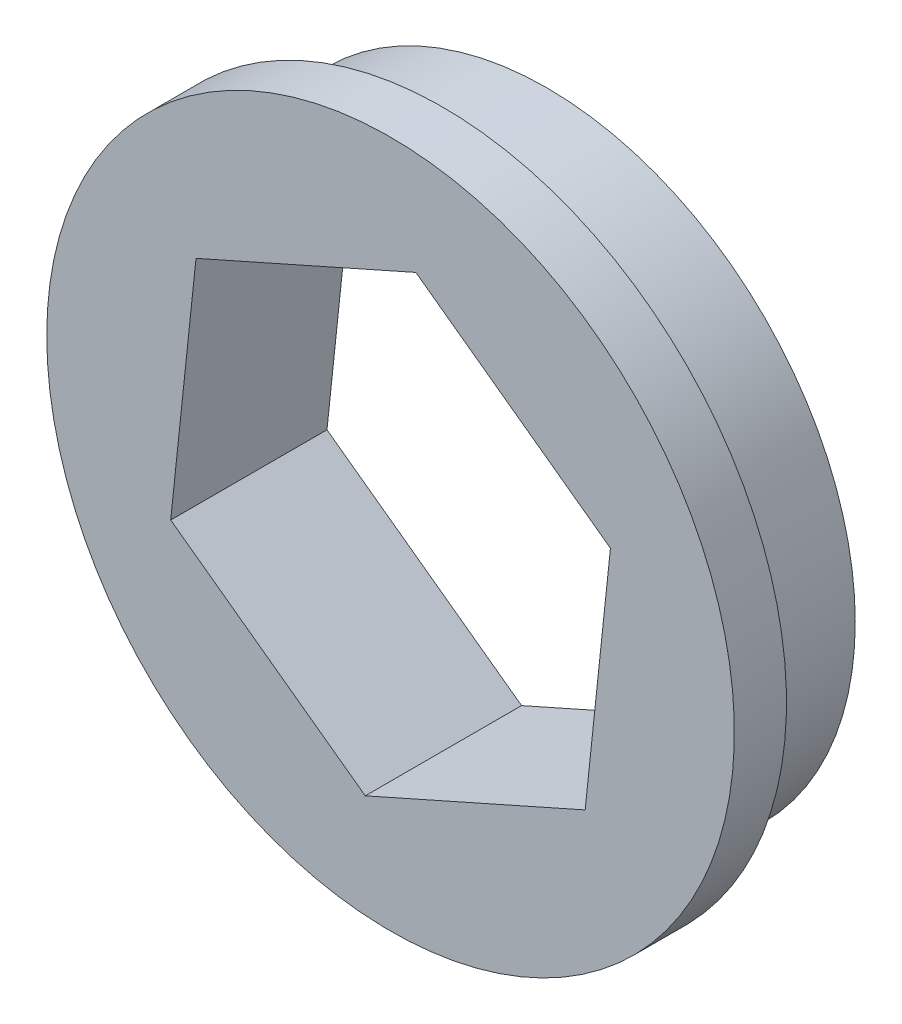
ISO-10303-21;
HEADER;
FILE_DESCRIPTION(('STEP AP214'),'2;1');
FILE_NAME('part.step','',(''),(''),'','','');
FILE_SCHEMA(('AUTOMOTIVE_DESIGN { 1 0 10303 214 1 1 1 1 }'));
ENDSEC;
DATA;
#1=APPLICATION_CONTEXT('core data for automotive mechanical design processes');
#2=APPLICATION_PROTOCOL_DEFINITION('international standard','automotive_design',2000,#1);
#3=PRODUCT_CONTEXT('',#1,'mechanical');
#4=PRODUCT('Part','Part','',(#3));
#5=PRODUCT_RELATED_PRODUCT_CATEGORY('part','',(#4));
#6=PRODUCT_DEFINITION_FORMATION('','',#4);
#7=PRODUCT_DEFINITION_CONTEXT('part definition',#1,'design');
#8=PRODUCT_DEFINITION('design','',#6,#7);
#9=PRODUCT_DEFINITION_SHAPE('','',#8);
#10=(LENGTH_UNIT() NAMED_UNIT(*) SI_UNIT(.MILLI.,.METRE.));
#11=(NAMED_UNIT(*) PLANE_ANGLE_UNIT() SI_UNIT($,.RADIAN.));
#12=(NAMED_UNIT(*) SI_UNIT($,.STERADIAN.) SOLID_ANGLE_UNIT());
#13=UNCERTAINTY_MEASURE_WITH_UNIT(LENGTH_MEASURE(1.E-05),#10,'distance_accuracy_value','');
#14=(GEOMETRIC_REPRESENTATION_CONTEXT(3) GLOBAL_UNCERTAINTY_ASSIGNED_CONTEXT((#13)) GLOBAL_UNIT_ASSIGNED_CONTEXT((#10,
#11,#12)) REPRESENTATION_CONTEXT('',''));
#15=CARTESIAN_POINT('',(0.,0.,0.));
#16=DIRECTION('',(0.,0.,1.));
#17=DIRECTION('',(1.,0.,0.));
#18=AXIS2_PLACEMENT_3D('',#15,#16,#17);
#19=CARTESIAN_POINT('',(0.,0.,3.175));
#20=DIRECTION('',(0.,0.,-1.));
#21=DIRECTION('',(-1.,0.,0.));
#22=AXIS2_PLACEMENT_3D('',#19,#20,#21);
#23=CYLINDRICAL_SURFACE('',#22,9.398);
#24=CARTESIAN_POINT('',(0.,0.,0.));
#25=DIRECTION('',(0.,0.,-1.));
#26=DIRECTION('',(-1.,0.,0.));
#27=AXIS2_PLACEMENT_3D('',#24,#25,#26);
#28=CIRCLE('',#27,9.398);
#29=CARTESIAN_POINT('',(-9.398,0.,0.));
#30=VERTEX_POINT('',#29);
#31=EDGE_CURVE('E103',#30,#30,#28,.F.);
#32=ORIENTED_EDGE('',*,*,#31,.T.);
#33=EDGE_LOOP('',(#32));
#34=FACE_BOUND('',#33,.T.);
#35=CARTESIAN_POINT('',(0.,0.,3.175));
#36=DIRECTION('',(0.,0.,-1.));
#37=DIRECTION('',(-1.,0.,0.));
#38=AXIS2_PLACEMENT_3D('',#35,#36,#37);
#39=CIRCLE('',#38,9.398);
#40=CARTESIAN_POINT('',(-9.398,0.,3.175));
#41=VERTEX_POINT('',#40);
#42=EDGE_CURVE('E20',#41,#41,#39,.T.);
#43=ORIENTED_EDGE('',*,*,#42,.T.);
#44=EDGE_LOOP('',(#43));
#45=FACE_BOUND('',#44,.T.);
#46=ADVANCED_FACE('F17',(#34,#45),#23,.T.);
#47=CARTESIAN_POINT('',(0.,0.,3.175));
#48=DIRECTION('',(0.,0.,1.));
#49=DIRECTION('',(1.,0.,0.));
#50=AXIS2_PLACEMENT_3D('',#47,#48,#49);
#51=PLANE('',#50);
#52=ORIENTED_EDGE('',*,*,#42,.F.);
#53=EDGE_LOOP('',(#52));
#54=FACE_BOUND('',#53,.T.);
#55=CARTESIAN_POINT('',(0.,0.,3.175));
#56=DIRECTION('',(0.,0.,-1.));
#57=DIRECTION('',(-1.,0.,0.));
#58=AXIS2_PLACEMENT_3D('',#55,#56,#57);
#59=CIRCLE('',#58,10.4775);
#60=CARTESIAN_POINT('',(-10.4775,0.,3.175));
#61=VERTEX_POINT('',#60);
#62=EDGE_CURVE('E87',#61,#61,#59,.F.);
#63=ORIENTED_EDGE('',*,*,#62,.F.);
#64=EDGE_LOOP('',(#63));
#65=FACE_BOUND('',#64,.T.);
#66=ADVANCED_FACE('F111',(#54,#65),#51,.F.);
#67=CARTESIAN_POINT('',(0.,0.,0.));
#68=DIRECTION('',(0.,0.,1.));
#69=DIRECTION('',(1.,0.,0.));
#70=AXIS2_PLACEMENT_3D('',#67,#68,#69);
#71=PLANE('',#70);
#72=DIRECTION('',(0.913795750397395,0.406174010192259,0.));
#73=VECTOR('',#72,1.);
#74=CARTESIAN_POINT('',(0.770929448003481,7.29170769570027,0.));
#75=LINE('',#74,#73);
#76=CARTESIAN_POINT('',(-5.9293393774452,4.31349833434665,0.));
#77=VERTEX_POINT('',#76);
#78=CARTESIAN_POINT('',(0.770929448003468,7.29170769570028,0.));
#79=VERTEX_POINT('',#78);
#80=EDGE_CURVE('E74',#77,#79,#75,.T.);
#81=ORIENTED_EDGE('',*,*,#80,.F.);
#82=DIRECTION('',(0.105140864015202,0.994457338810538,0.));
#83=VECTOR('',#82,1.);
#84=CARTESIAN_POINT('',(-5.92933937744518,4.31349833434666,0.));
#85=LINE('',#84,#83);
#86=CARTESIAN_POINT('',(-6.70026882544866,-2.97820936135361,0.));
#87=VERTEX_POINT('',#86);
#88=EDGE_CURVE('E238',#87,#77,#85,.T.);
#89=ORIENTED_EDGE('',*,*,#88,.F.);
#90=DIRECTION('',(-0.808654886382194,0.588283328618279,0.));
#91=VECTOR('',#90,1.);
#92=CARTESIAN_POINT('',(-6.70026882544865,-2.97820936135359,0.));
#93=LINE('',#92,#91);
#94=CARTESIAN_POINT('',(-0.770929448003467,-7.29170769570028,0.));
#95=VERTEX_POINT('',#94);
#96=EDGE_CURVE('E243',#95,#87,#93,.T.);
#97=ORIENTED_EDGE('',*,*,#96,.F.);
#98=DIRECTION('',(-0.913795750397395,-0.406174010192259,0.));
#99=VECTOR('',#98,1.);
#100=CARTESIAN_POINT('',(-0.770929448003481,-7.29170769570027,0.));
#101=LINE('',#100,#99);
#102=CARTESIAN_POINT('',(5.9293393774452,-4.31349833434665,0.));
#103=VERTEX_POINT('',#102);
#104=EDGE_CURVE('E246',#103,#95,#101,.T.);
#105=ORIENTED_EDGE('',*,*,#104,.F.);
#106=DIRECTION('',(-0.105140864015202,-0.994457338810538,0.));
#107=VECTOR('',#106,1.);
#108=CARTESIAN_POINT('',(5.92933937744518,-4.31349833434666,0.));
#109=LINE('',#108,#107);
#110=CARTESIAN_POINT('',(6.70026882544866,2.97820936135361,0.));
#111=VERTEX_POINT('',#110);
#112=EDGE_CURVE('E68',#111,#103,#109,.T.);
#113=ORIENTED_EDGE('',*,*,#112,.F.);
#114=DIRECTION('',(0.808654886382194,-0.588283328618279,0.));
#115=VECTOR('',#114,1.);
#116=CARTESIAN_POINT('',(6.70026882544865,2.97820936135359,0.));
#117=LINE('',#116,#115);
#118=EDGE_CURVE('E70',#79,#111,#117,.T.);
#119=ORIENTED_EDGE('',*,*,#118,.F.);
#120=EDGE_LOOP('',(#81,#89,#97,#105,#113,#119));
#121=FACE_BOUND('',#120,.T.);
#122=ORIENTED_EDGE('',*,*,#31,.F.);
#123=EDGE_LOOP('',(#122));
#124=FACE_BOUND('',#123,.T.);
#125=ADVANCED_FACE('F72',(#121,#124),#71,.F.);
#126=CARTESIAN_POINT('',(0.,0.,4.7625));
#127=DIRECTION('',(0.,0.,-1.));
#128=DIRECTION('',(-1.,0.,0.));
#129=AXIS2_PLACEMENT_3D('',#126,#127,#128);
#130=CYLINDRICAL_SURFACE('',#129,10.4775);
#131=ORIENTED_EDGE('',*,*,#62,.T.);
#132=EDGE_LOOP('',(#131));
#133=FACE_BOUND('',#132,.T.);
#134=CARTESIAN_POINT('',(0.,0.,4.7625));
#135=DIRECTION('',(0.,0.,-1.));
#136=DIRECTION('',(-1.,0.,0.));
#137=AXIS2_PLACEMENT_3D('',#134,#135,#136);
#138=CIRCLE('',#137,10.4775);
#139=CARTESIAN_POINT('',(-10.4775,0.,4.7625));
#140=VERTEX_POINT('',#139);
#141=EDGE_CURVE('E98',#140,#140,#138,.F.);
#142=ORIENTED_EDGE('',*,*,#141,.F.);
#143=EDGE_LOOP('',(#142));
#144=FACE_BOUND('',#143,.T.);
#145=ADVANCED_FACE('F116',(#133,#144),#130,.T.);
#146=CARTESIAN_POINT('',(0.770929448003481,7.29170769570027,3.175));
#147=DIRECTION('',(0.406174010192259,-0.913795750397395,0.));
#148=DIRECTION('',(0.913795750397395,0.406174010192259,0.));
#149=AXIS2_PLACEMENT_3D('',#146,#147,#148);
#150=PLANE('',#149);
#151=DIRECTION('',(0.913795750397391,0.406174010192268,0.));
#152=VECTOR('',#151,1.);
#153=CARTESIAN_POINT('',(-5.92933937744523,4.31349833434661,4.7625));
#154=LINE('',#153,#152);
#155=CARTESIAN_POINT('',(-5.92933937744522,4.31349833434664,4.7625));
#156=VERTEX_POINT('',#155);
#157=CARTESIAN_POINT('',(0.770929448003449,7.29170769570028,4.7625));
#158=VERTEX_POINT('',#157);
#159=EDGE_CURVE('E101',#156,#158,#154,.T.);
#160=ORIENTED_EDGE('',*,*,#159,.F.);
#161=DIRECTION('',(0.,0.,1.));
#162=VECTOR('',#161,1.);
#163=CARTESIAN_POINT('',(-5.92933937744518,4.31349833434666,3.175));
#164=LINE('',#163,#162);
#165=EDGE_CURVE('E85',#77,#156,#164,.T.);
#166=ORIENTED_EDGE('',*,*,#165,.F.);
#167=ORIENTED_EDGE('',*,*,#80,.T.);
#168=DIRECTION('',(0.,0.,1.));
#169=VECTOR('',#168,1.);
#170=CARTESIAN_POINT('',(0.770929448003423,7.29170769570029,3.175));
#171=LINE('',#170,#169);
#172=EDGE_CURVE('E79',#158,#79,#171,.F.);
#173=ORIENTED_EDGE('',*,*,#172,.F.);
#174=EDGE_LOOP('',(#160,#166,#167,#173));
#175=FACE_BOUND('',#174,.T.);
#176=ADVANCED_FACE('F82',(#175),#150,.T.);
#177=CARTESIAN_POINT('',(6.70026882544865,2.97820936135359,3.175));
#178=DIRECTION('',(-0.588283328618279,-0.808654886382194,0.));
#179=DIRECTION('',(0.808654886382194,-0.588283328618279,0.));
#180=AXIS2_PLACEMENT_3D('',#177,#178,#179);
#181=PLANE('',#180);
#182=DIRECTION('',(0.808654886382199,-0.588283328618271,0.));
#183=VECTOR('',#182,1.);
#184=CARTESIAN_POINT('',(0.770929448003408,7.29170769570027,4.7625));
#185=LINE('',#184,#183);
#186=CARTESIAN_POINT('',(6.70026882544865,2.97820936135363,4.7625));
#187=VERTEX_POINT('',#186);
#188=EDGE_CURVE('E91',#158,#187,#185,.T.);
#189=ORIENTED_EDGE('',*,*,#188,.F.);
#190=ORIENTED_EDGE('',*,*,#172,.T.);
#191=ORIENTED_EDGE('',*,*,#118,.T.);
#192=DIRECTION('',(0.,0.,1.));
#193=VECTOR('',#192,1.);
#194=CARTESIAN_POINT('',(6.70026882544867,2.97820936135366,3.175));
#195=LINE('',#194,#193);
#196=EDGE_CURVE('E94',#187,#111,#195,.F.);
#197=ORIENTED_EDGE('',*,*,#196,.F.);
#198=EDGE_LOOP('',(#189,#190,#191,#197));
#199=FACE_BOUND('',#198,.T.);
#200=ADVANCED_FACE('F89',(#199),#181,.T.);
#201=CARTESIAN_POINT('',(5.92933937744518,-4.31349833434666,3.175));
#202=DIRECTION('',(-0.994457338810538,0.105140864015202,0.));
#203=DIRECTION('',(-0.105140864015202,-0.994457338810538,0.));
#204=AXIS2_PLACEMENT_3D('',#201,#202,#203);
#205=PLANE('',#204);
#206=DIRECTION('',(-0.10514086401519,-0.994457338810539,0.));
#207=VECTOR('',#206,1.);
#208=CARTESIAN_POINT('',(6.70026882544863,2.97820936135367,4.7625));
#209=LINE('',#208,#207);
#210=CARTESIAN_POINT('',(5.92933937744521,-4.31349833434664,4.7625));
#211=VERTEX_POINT('',#210);
#212=EDGE_CURVE('E225',#187,#211,#209,.T.);
#213=ORIENTED_EDGE('',*,*,#212,.F.);
#214=ORIENTED_EDGE('',*,*,#196,.T.);
#215=ORIENTED_EDGE('',*,*,#112,.T.);
#216=DIRECTION('',(0.,0.,1.));
#217=VECTOR('',#216,1.);
#218=CARTESIAN_POINT('',(5.92933937744525,-4.31349833434664,3.175));
#219=LINE('',#218,#217);
#220=EDGE_CURVE('E227',#211,#103,#219,.F.);
#221=ORIENTED_EDGE('',*,*,#220,.F.);
#222=EDGE_LOOP('',(#213,#214,#215,#221));
#223=FACE_BOUND('',#222,.T.);
#224=ADVANCED_FACE('F141',(#223),#205,.T.);
#225=CARTESIAN_POINT('',(-0.770929448003481,-7.29170769570027,3.175));
#226=DIRECTION('',(-0.406174010192259,0.913795750397395,0.));
#227=DIRECTION('',(-0.913795750397395,-0.406174010192259,0.));
#228=AXIS2_PLACEMENT_3D('',#225,#226,#227);
#229=PLANE('',#228);
#230=DIRECTION('',(-0.913795750397391,-0.406174010192268,0.));
#231=VECTOR('',#230,1.);
#232=CARTESIAN_POINT('',(5.92933937744523,-4.31349833434661,4.7625));
#233=LINE('',#232,#231);
#234=CARTESIAN_POINT('',(-0.770929448003446,-7.29170769570028,4.7625));
#235=VERTEX_POINT('',#234);
#236=EDGE_CURVE('E230',#211,#235,#233,.T.);
#237=ORIENTED_EDGE('',*,*,#236,.F.);
#238=ORIENTED_EDGE('',*,*,#220,.T.);
#239=ORIENTED_EDGE('',*,*,#104,.T.);
#240=DIRECTION('',(0.,0.,1.));
#241=VECTOR('',#240,1.);
#242=CARTESIAN_POINT('',(-0.770929448003419,-7.2917076957003,3.175));
#243=LINE('',#242,#241);
#244=EDGE_CURVE('E240',#235,#95,#243,.F.);
#245=ORIENTED_EDGE('',*,*,#244,.F.);
#246=EDGE_LOOP('',(#237,#238,#239,#245));
#247=FACE_BOUND('',#246,.T.);
#248=ADVANCED_FACE('F138',(#247),#229,.T.);
#249=CARTESIAN_POINT('',(-6.70026882544865,-2.97820936135359,3.175));
#250=DIRECTION('',(0.588283328618279,0.808654886382194,0.));
#251=DIRECTION('',(-0.808654886382194,0.588283328618279,0.));
#252=AXIS2_PLACEMENT_3D('',#249,#250,#251);
#253=PLANE('',#252);
#254=DIRECTION('',(-0.8086548863822,0.58828332861827,0.));
#255=VECTOR('',#254,1.);
#256=CARTESIAN_POINT('',(-0.770929448003403,-7.29170769570027,4.7625));
#257=LINE('',#256,#255);
#258=CARTESIAN_POINT('',(-6.70026882544865,-2.97820936135363,4.7625));
#259=VERTEX_POINT('',#258);
#260=EDGE_CURVE('E26',#235,#259,#257,.T.);
#261=ORIENTED_EDGE('',*,*,#260,.F.);
#262=ORIENTED_EDGE('',*,*,#244,.T.);
#263=ORIENTED_EDGE('',*,*,#96,.T.);
#264=DIRECTION('',(0.,0.,1.));
#265=VECTOR('',#264,1.);
#266=CARTESIAN_POINT('',(-6.70026882544867,-2.97820936135366,3.175));
#267=LINE('',#266,#265);
#268=EDGE_CURVE('E35',#259,#87,#267,.F.);
#269=ORIENTED_EDGE('',*,*,#268,.F.);
#270=EDGE_LOOP('',(#261,#262,#263,#269));
#271=FACE_BOUND('',#270,.T.);
#272=ADVANCED_FACE('F131',(#271),#253,.T.);
#273=CARTESIAN_POINT('',(-5.92933937744518,4.31349833434666,3.175));
#274=DIRECTION('',(0.994457338810538,-0.105140864015202,0.));
#275=DIRECTION('',(0.105140864015202,0.994457338810538,0.));
#276=AXIS2_PLACEMENT_3D('',#273,#274,#275);
#277=PLANE('',#276);
#278=DIRECTION('',(0.10514086401519,0.994457338810539,0.));
#279=VECTOR('',#278,1.);
#280=CARTESIAN_POINT('',(-6.70026882544863,-2.97820936135367,4.7625));
#281=LINE('',#280,#279);
#282=EDGE_CURVE('E11',#259,#156,#281,.T.);
#283=ORIENTED_EDGE('',*,*,#282,.F.);
#284=ORIENTED_EDGE('',*,*,#268,.T.);
#285=ORIENTED_EDGE('',*,*,#88,.T.);
#286=ORIENTED_EDGE('',*,*,#165,.T.);
#287=EDGE_LOOP('',(#283,#284,#285,#286));
#288=FACE_BOUND('',#287,.T.);
#289=ADVANCED_FACE('F124',(#288),#277,.T.);
#290=CARTESIAN_POINT('',(0.,0.,4.7625));
#291=DIRECTION('',(0.,0.,1.));
#292=DIRECTION('',(1.,0.,0.));
#293=AXIS2_PLACEMENT_3D('',#290,#291,#292);
#294=PLANE('',#293);
#295=ORIENTED_EDGE('',*,*,#260,.T.);
#296=ORIENTED_EDGE('',*,*,#282,.T.);
#297=ORIENTED_EDGE('',*,*,#159,.T.);
#298=ORIENTED_EDGE('',*,*,#188,.T.);
#299=ORIENTED_EDGE('',*,*,#212,.T.);
#300=ORIENTED_EDGE('',*,*,#236,.T.);
#301=EDGE_LOOP('',(#295,#296,#297,#298,#299,#300));
#302=FACE_BOUND('',#301,.T.);
#303=ORIENTED_EDGE('',*,*,#141,.T.);
#304=EDGE_LOOP('',(#303));
#305=FACE_BOUND('',#304,.T.);
#306=ADVANCED_FACE('F122',(#302,#305),#294,.T.);
#307=CLOSED_SHELL('',(#46,#66,#125,#145,#176,#200,#224,#248,#272,#289,#306));
#308=MANIFOLD_SOLID_BREP('B1',#307);
#309=ADVANCED_BREP_SHAPE_REPRESENTATION('',(#18,#308),#14);
#310=SHAPE_DEFINITION_REPRESENTATION(#9,#309);
ENDSEC;
END-ISO-10303-21;
